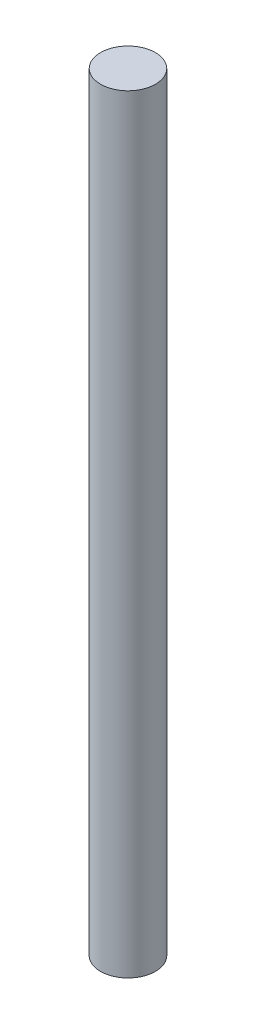
ISO-10303-21;
HEADER;
FILE_DESCRIPTION(('STEP AP214'),'2;1');
FILE_NAME('part.step','',(''),(''),'','','');
FILE_SCHEMA(('AUTOMOTIVE_DESIGN { 1 0 10303 214 1 1 1 1 }'));
ENDSEC;
DATA;
#1=APPLICATION_CONTEXT('core data for automotive mechanical design processes');
#2=APPLICATION_PROTOCOL_DEFINITION('international standard','automotive_design',2000,#1);
#3=PRODUCT_CONTEXT('',#1,'mechanical');
#4=PRODUCT('Part','Part','',(#3));
#5=PRODUCT_RELATED_PRODUCT_CATEGORY('part','',(#4));
#6=PRODUCT_DEFINITION_FORMATION('','',#4);
#7=PRODUCT_DEFINITION_CONTEXT('part definition',#1,'design');
#8=PRODUCT_DEFINITION('design','',#6,#7);
#9=PRODUCT_DEFINITION_SHAPE('','',#8);
#10=(LENGTH_UNIT() NAMED_UNIT(*) SI_UNIT(.MILLI.,.METRE.));
#11=(NAMED_UNIT(*) PLANE_ANGLE_UNIT() SI_UNIT($,.RADIAN.));
#12=(NAMED_UNIT(*) SI_UNIT($,.STERADIAN.) SOLID_ANGLE_UNIT());
#13=UNCERTAINTY_MEASURE_WITH_UNIT(LENGTH_MEASURE(1.E-05),#10,'distance_accuracy_value','');
#14=(GEOMETRIC_REPRESENTATION_CONTEXT(3) GLOBAL_UNCERTAINTY_ASSIGNED_CONTEXT((#13)) GLOBAL_UNIT_ASSIGNED_CONTEXT((#10,
#11,#12)) REPRESENTATION_CONTEXT('',''));
#15=CARTESIAN_POINT('',(0.,0.,0.));
#16=DIRECTION('',(0.,0.,1.));
#17=DIRECTION('',(1.,0.,0.));
#18=AXIS2_PLACEMENT_3D('',#15,#16,#17);
#19=CARTESIAN_POINT('',(0.,70.,0.));
#20=DIRECTION('',(0.,-1.,0.));
#21=DIRECTION('',(0.,0.,-1.));
#22=AXIS2_PLACEMENT_3D('',#19,#20,#21);
#23=CYLINDRICAL_SURFACE('',#22,2.5);
#24=CARTESIAN_POINT('',(0.,70.,0.));
#25=DIRECTION('',(0.,1.,0.));
#26=DIRECTION('',(0.,0.,1.));
#27=AXIS2_PLACEMENT_3D('',#24,#25,#26);
#28=CIRCLE('',#27,2.5);
#29=CARTESIAN_POINT('',(0.,70.,2.5));
#30=VERTEX_POINT('',#29);
#31=EDGE_CURVE('E10',#30,#30,#28,.T.);
#32=ORIENTED_EDGE('',*,*,#31,.F.);
#33=EDGE_LOOP('',(#32));
#34=FACE_BOUND('',#33,.T.);
#35=CARTESIAN_POINT('',(0.,0.,0.));
#36=DIRECTION('',(0.,1.,0.));
#37=DIRECTION('',(0.,0.,1.));
#38=AXIS2_PLACEMENT_3D('',#35,#36,#37);
#39=CIRCLE('',#38,2.5);
#40=CARTESIAN_POINT('',(0.,0.,2.5));
#41=VERTEX_POINT('',#40);
#42=EDGE_CURVE('E33',#41,#41,#39,.T.);
#43=ORIENTED_EDGE('',*,*,#42,.T.);
#44=EDGE_LOOP('',(#43));
#45=FACE_BOUND('',#44,.T.);
#46=ADVANCED_FACE('F30',(#34,#45),#23,.T.);
#47=CARTESIAN_POINT('',(0.,70.,0.));
#48=DIRECTION('',(0.,1.,0.));
#49=DIRECTION('',(0.,0.,1.));
#50=AXIS2_PLACEMENT_3D('',#47,#48,#49);
#51=PLANE('',#50);
#52=ORIENTED_EDGE('',*,*,#31,.T.);
#53=EDGE_LOOP('',(#52));
#54=FACE_BOUND('',#53,.T.);
#55=ADVANCED_FACE('F45',(#54),#51,.T.);
#56=CARTESIAN_POINT('',(0.,0.,0.));
#57=DIRECTION('',(0.,1.,0.));
#58=DIRECTION('',(0.,0.,1.));
#59=AXIS2_PLACEMENT_3D('',#56,#57,#58);
#60=PLANE('',#59);
#61=ORIENTED_EDGE('',*,*,#42,.F.);
#62=EDGE_LOOP('',(#61));
#63=FACE_BOUND('',#62,.T.);
#64=ADVANCED_FACE('F43',(#63),#60,.F.);
#65=CLOSED_SHELL('',(#46,#55,#64));
#66=MANIFOLD_SOLID_BREP('B2',#65);
#67=ADVANCED_BREP_SHAPE_REPRESENTATION('',(#18,#66),#14);
#68=SHAPE_DEFINITION_REPRESENTATION(#9,#67);
ENDSEC;
END-ISO-10303-21;
